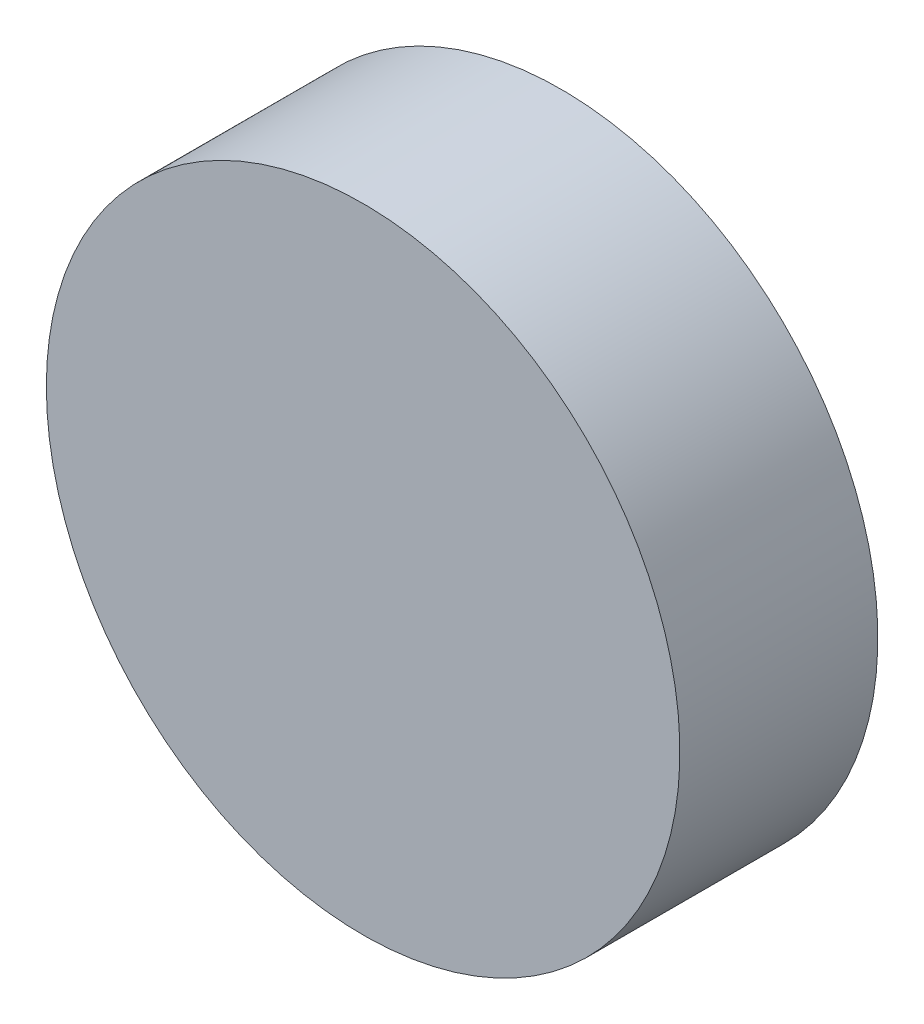
ISO-10303-21;
HEADER;
FILE_DESCRIPTION(('STEP AP214'),'2;1');
FILE_NAME('part.step','',(''),(''),'','','');
FILE_SCHEMA(('AUTOMOTIVE_DESIGN { 1 0 10303 214 1 1 1 1 }'));
ENDSEC;
DATA;
#1=APPLICATION_CONTEXT('core data for automotive mechanical design processes');
#2=APPLICATION_PROTOCOL_DEFINITION('international standard','automotive_design',2000,#1);
#3=PRODUCT_CONTEXT('',#1,'mechanical');
#4=PRODUCT('Part','Part','',(#3));
#5=PRODUCT_RELATED_PRODUCT_CATEGORY('part','',(#4));
#6=PRODUCT_DEFINITION_FORMATION('','',#4);
#7=PRODUCT_DEFINITION_CONTEXT('part definition',#1,'design');
#8=PRODUCT_DEFINITION('design','',#6,#7);
#9=PRODUCT_DEFINITION_SHAPE('','',#8);
#10=(LENGTH_UNIT() NAMED_UNIT(*) SI_UNIT(.MILLI.,.METRE.));
#11=(NAMED_UNIT(*) PLANE_ANGLE_UNIT() SI_UNIT($,.RADIAN.));
#12=(NAMED_UNIT(*) SI_UNIT($,.STERADIAN.) SOLID_ANGLE_UNIT());
#13=UNCERTAINTY_MEASURE_WITH_UNIT(LENGTH_MEASURE(1.E-05),#10,'distance_accuracy_value','');
#14=(GEOMETRIC_REPRESENTATION_CONTEXT(3) GLOBAL_UNCERTAINTY_ASSIGNED_CONTEXT((#13)) GLOBAL_UNIT_ASSIGNED_CONTEXT((#10,
#11,#12)) REPRESENTATION_CONTEXT('',''));
#15=CARTESIAN_POINT('',(0.,0.,0.));
#16=DIRECTION('',(0.,0.,1.));
#17=DIRECTION('',(1.,0.,0.));
#18=AXIS2_PLACEMENT_3D('',#15,#16,#17);
#19=CARTESIAN_POINT('',(0.,0.,0.));
#20=DIRECTION('',(0.,0.,-1.));
#21=DIRECTION('',(-1.,0.,0.));
#22=AXIS2_PLACEMENT_3D('',#19,#20,#21);
#23=PLANE('',#22);
#24=CARTESIAN_POINT('',(0.,0.,0.));
#25=DIRECTION('',(0.,0.,-1.));
#26=DIRECTION('',(-1.,0.,0.));
#27=AXIS2_PLACEMENT_3D('',#24,#25,#26);
#28=CIRCLE('',#27,8.);
#29=CARTESIAN_POINT('',(-8.,0.,0.));
#30=VERTEX_POINT('',#29);
#31=EDGE_CURVE('E43',#30,#30,#28,.T.);
#32=ORIENTED_EDGE('',*,*,#31,.F.);
#33=EDGE_LOOP('',(#32));
#34=FACE_BOUND('',#33,.T.);
#35=ADVANCED_FACE('F32',(#34),#23,.F.);
#36=CARTESIAN_POINT('',(0.,0.,-9.));
#37=DIRECTION('',(0.,0.,-1.));
#38=DIRECTION('',(-1.,0.,0.));
#39=AXIS2_PLACEMENT_3D('',#36,#37,#38);
#40=CYLINDRICAL_SURFACE('',#39,8.);
#41=CARTESIAN_POINT('',(0.,0.,-5.));
#42=DIRECTION('',(0.,0.,-1.));
#43=DIRECTION('',(-1.,0.,0.));
#44=AXIS2_PLACEMENT_3D('',#41,#42,#43);
#45=CIRCLE('',#44,8.);
#46=CARTESIAN_POINT('',(-8.,0.,-5.));
#47=VERTEX_POINT('',#46);
#48=EDGE_CURVE('E47',#47,#47,#45,.T.);
#49=ORIENTED_EDGE('',*,*,#48,.F.);
#50=EDGE_LOOP('',(#49));
#51=FACE_BOUND('',#50,.T.);
#52=ORIENTED_EDGE('',*,*,#31,.T.);
#53=EDGE_LOOP('',(#52));
#54=FACE_BOUND('',#53,.T.);
#55=ADVANCED_FACE('F79',(#51,#54),#40,.T.);
#56=CARTESIAN_POINT('',(8.,0.,-5.));
#57=DIRECTION('',(0.,0.,1.));
#58=DIRECTION('',(1.,0.,0.));
#59=AXIS2_PLACEMENT_3D('',#56,#57,#58);
#60=PLANE('',#59);
#61=CARTESIAN_POINT('',(0.,0.,-5.));
#62=DIRECTION('',(0.,0.,-1.));
#63=DIRECTION('',(-1.,0.,0.));
#64=AXIS2_PLACEMENT_3D('',#61,#62,#63);
#65=CIRCLE('',#64,3.);
#66=CARTESIAN_POINT('',(-3.,0.,-5.));
#67=VERTEX_POINT('',#66);
#68=EDGE_CURVE('E52',#67,#67,#65,.T.);
#69=ORIENTED_EDGE('',*,*,#68,.F.);
#70=EDGE_LOOP('',(#69));
#71=FACE_BOUND('',#70,.T.);
#72=ORIENTED_EDGE('',*,*,#48,.T.);
#73=EDGE_LOOP('',(#72));
#74=FACE_BOUND('',#73,.T.);
#75=ADVANCED_FACE('F73',(#71,#74),#60,.F.);
#76=CARTESIAN_POINT('',(0.,0.,-9.));
#77=DIRECTION('',(0.,0.,-1.));
#78=DIRECTION('',(-1.,0.,0.));
#79=AXIS2_PLACEMENT_3D('',#76,#77,#78);
#80=CYLINDRICAL_SURFACE('',#79,3.);
#81=CARTESIAN_POINT('',(0.,0.,-6.));
#82=DIRECTION('',(0.,0.,-1.));
#83=DIRECTION('',(-1.,0.,0.));
#84=AXIS2_PLACEMENT_3D('',#81,#82,#83);
#85=CIRCLE('',#84,3.);
#86=CARTESIAN_POINT('',(-3.,0.,-6.));
#87=VERTEX_POINT('',#86);
#88=EDGE_CURVE('E55',#87,#87,#85,.T.);
#89=ORIENTED_EDGE('',*,*,#88,.F.);
#90=EDGE_LOOP('',(#89));
#91=FACE_BOUND('',#90,.T.);
#92=ORIENTED_EDGE('',*,*,#68,.T.);
#93=EDGE_LOOP('',(#92));
#94=FACE_BOUND('',#93,.T.);
#95=ADVANCED_FACE('F67',(#91,#94),#80,.T.);
#96=CARTESIAN_POINT('',(3.,0.,-6.));
#97=DIRECTION('',(0.,0.,1.));
#98=DIRECTION('',(1.,0.,0.));
#99=AXIS2_PLACEMENT_3D('',#96,#97,#98);
#100=PLANE('',#99);
#101=CARTESIAN_POINT('',(0.,0.,-6.));
#102=DIRECTION('',(0.,0.,-1.));
#103=DIRECTION('',(-1.,0.,0.));
#104=AXIS2_PLACEMENT_3D('',#101,#102,#103);
#105=CIRCLE('',#104,2.);
#106=CARTESIAN_POINT('',(-2.,0.,-6.));
#107=VERTEX_POINT('',#106);
#108=EDGE_CURVE('E58',#107,#107,#105,.T.);
#109=ORIENTED_EDGE('',*,*,#108,.F.);
#110=EDGE_LOOP('',(#109));
#111=FACE_BOUND('',#110,.T.);
#112=ORIENTED_EDGE('',*,*,#88,.T.);
#113=EDGE_LOOP('',(#112));
#114=FACE_BOUND('',#113,.T.);
#115=ADVANCED_FACE('F64',(#111,#114),#100,.F.);
#116=CARTESIAN_POINT('',(0.,0.,-9.));
#117=DIRECTION('',(0.,0.,-1.));
#118=DIRECTION('',(-1.,0.,0.));
#119=AXIS2_PLACEMENT_3D('',#116,#117,#118);
#120=CYLINDRICAL_SURFACE('',#119,2.);
#121=CARTESIAN_POINT('',(0.,0.,-8.5));
#122=DIRECTION('',(0.,0.,1.));
#123=DIRECTION('',(1.,0.,0.));
#124=AXIS2_PLACEMENT_3D('',#121,#122,#123);
#125=CIRCLE('',#124,2.);
#126=CARTESIAN_POINT('',(2.,0.,-8.5));
#127=VERTEX_POINT('',#126);
#128=EDGE_CURVE('E10',#127,#127,#125,.T.);
#129=ORIENTED_EDGE('',*,*,#128,.T.);
#130=EDGE_LOOP('',(#129));
#131=FACE_BOUND('',#130,.T.);
#132=ORIENTED_EDGE('',*,*,#108,.T.);
#133=EDGE_LOOP('',(#132));
#134=FACE_BOUND('',#133,.T.);
#135=ADVANCED_FACE('F62',(#131,#134),#120,.T.);
#136=CARTESIAN_POINT('',(2.,0.,-9.));
#137=DIRECTION('',(0.,0.,1.));
#138=DIRECTION('',(1.,0.,0.));
#139=AXIS2_PLACEMENT_3D('',#136,#137,#138);
#140=PLANE('',#139);
#141=CARTESIAN_POINT('',(0.,0.,-9.));
#142=DIRECTION('',(0.,0.,1.));
#143=DIRECTION('',(1.,0.,0.));
#144=AXIS2_PLACEMENT_3D('',#141,#142,#143);
#145=CIRCLE('',#144,1.5);
#146=CARTESIAN_POINT('',(1.50000000000001,0.,-9.));
#147=VERTEX_POINT('',#146);
#148=EDGE_CURVE('E39',#147,#147,#145,.F.);
#149=ORIENTED_EDGE('',*,*,#148,.T.);
#150=EDGE_LOOP('',(#149));
#151=FACE_BOUND('',#150,.T.);
#152=ADVANCED_FACE('F94',(#151),#140,.F.);
#153=CARTESIAN_POINT('',(0.,0.,-9.));
#154=DIRECTION('',(0.,0.,1.));
#155=DIRECTION('',(1.,0.,0.));
#156=AXIS2_PLACEMENT_3D('',#153,#154,#155);
#157=CONICAL_SURFACE('',#156,1.5,0.785398163397445);
#158=ORIENTED_EDGE('',*,*,#128,.F.);
#159=EDGE_LOOP('',(#158));
#160=FACE_BOUND('',#159,.T.);
#161=ORIENTED_EDGE('',*,*,#148,.F.);
#162=EDGE_LOOP('',(#161));
#163=FACE_BOUND('',#162,.T.);
#164=ADVANCED_FACE('F34',(#160,#163),#157,.T.);
#165=CLOSED_SHELL('',(#35,#55,#75,#95,#115,#135,#152,#164));
#166=MANIFOLD_SOLID_BREP('B2',#165);
#167=ADVANCED_BREP_SHAPE_REPRESENTATION('',(#18,#166),#14);
#168=SHAPE_DEFINITION_REPRESENTATION(#9,#167);
ENDSEC;
END-ISO-10303-21;
